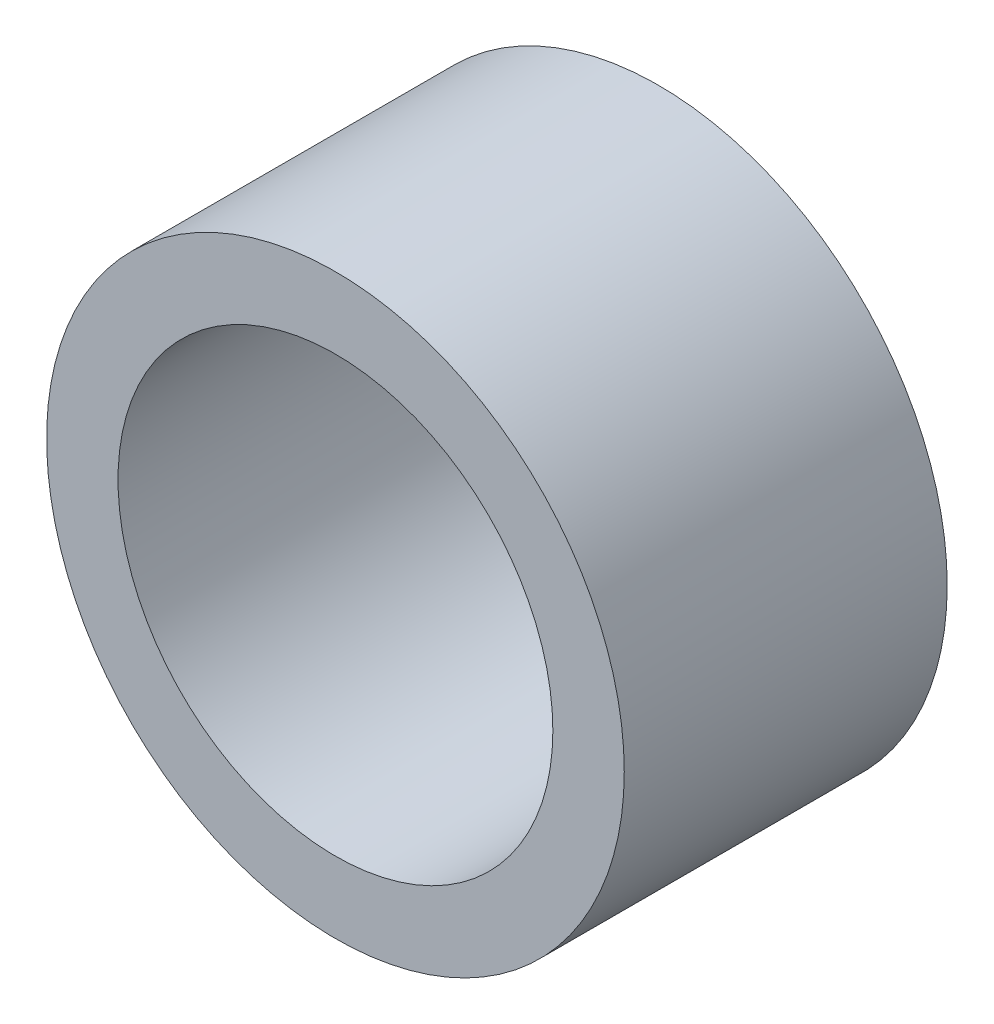
ISO-10303-21;
HEADER;
FILE_DESCRIPTION(('STEP AP214'),'2;1');
FILE_NAME('part.step','',(''),(''),'','','');
FILE_SCHEMA(('AUTOMOTIVE_DESIGN { 1 0 10303 214 1 1 1 1 }'));
ENDSEC;
DATA;
#1=APPLICATION_CONTEXT('core data for automotive mechanical design processes');
#2=APPLICATION_PROTOCOL_DEFINITION('international standard','automotive_design',2000,#1);
#3=PRODUCT_CONTEXT('',#1,'mechanical');
#4=PRODUCT('Part','Part','',(#3));
#5=PRODUCT_RELATED_PRODUCT_CATEGORY('part','',(#4));
#6=PRODUCT_DEFINITION_FORMATION('','',#4);
#7=PRODUCT_DEFINITION_CONTEXT('part definition',#1,'design');
#8=PRODUCT_DEFINITION('design','',#6,#7);
#9=PRODUCT_DEFINITION_SHAPE('','',#8);
#10=(LENGTH_UNIT() NAMED_UNIT(*) SI_UNIT(.MILLI.,.METRE.));
#11=(NAMED_UNIT(*) PLANE_ANGLE_UNIT() SI_UNIT($,.RADIAN.));
#12=(NAMED_UNIT(*) SI_UNIT($,.STERADIAN.) SOLID_ANGLE_UNIT());
#13=UNCERTAINTY_MEASURE_WITH_UNIT(LENGTH_MEASURE(1.E-05),#10,'distance_accuracy_value','');
#14=(GEOMETRIC_REPRESENTATION_CONTEXT(3) GLOBAL_UNCERTAINTY_ASSIGNED_CONTEXT((#13)) GLOBAL_UNIT_ASSIGNED_CONTEXT((#10,
#11,#12)) REPRESENTATION_CONTEXT('',''));
#15=CARTESIAN_POINT('',(0.,0.,0.));
#16=DIRECTION('',(0.,0.,1.));
#17=DIRECTION('',(1.,0.,0.));
#18=AXIS2_PLACEMENT_3D('',#15,#16,#17);
#19=CARTESIAN_POINT('',(0.,0.,14.2));
#20=DIRECTION('',(0.,0.,1.));
#21=DIRECTION('',(1.,0.,0.));
#22=AXIS2_PLACEMENT_3D('',#19,#20,#21);
#23=PLANE('',#22);
#24=CARTESIAN_POINT('',(0.,0.,14.2));
#25=DIRECTION('',(0.,0.,1.));
#26=DIRECTION('',(1.,0.,0.));
#27=AXIS2_PLACEMENT_3D('',#24,#25,#26);
#28=CIRCLE('',#27,12.7);
#29=CARTESIAN_POINT('',(12.7,0.,14.2));
#30=VERTEX_POINT('',#29);
#31=EDGE_CURVE('E10',#30,#30,#28,.T.);
#32=ORIENTED_EDGE('',*,*,#31,.T.);
#33=EDGE_LOOP('',(#32));
#34=FACE_BOUND('',#33,.T.);
#35=CARTESIAN_POINT('',(0.,0.,14.2));
#36=DIRECTION('',(0.,0.,1.));
#37=DIRECTION('',(1.,0.,0.));
#38=AXIS2_PLACEMENT_3D('',#35,#36,#37);
#39=CIRCLE('',#38,9.56);
#40=CARTESIAN_POINT('',(9.56,0.,14.2));
#41=VERTEX_POINT('',#40);
#42=EDGE_CURVE('E41',#41,#41,#39,.T.);
#43=ORIENTED_EDGE('',*,*,#42,.F.);
#44=EDGE_LOOP('',(#43));
#45=FACE_BOUND('',#44,.T.);
#46=ADVANCED_FACE('F30',(#34,#45),#23,.T.);
#47=CARTESIAN_POINT('',(0.,0.,0.));
#48=DIRECTION('',(0.,0.,1.));
#49=DIRECTION('',(1.,0.,0.));
#50=AXIS2_PLACEMENT_3D('',#47,#48,#49);
#51=PLANE('',#50);
#52=CARTESIAN_POINT('',(0.,0.,0.));
#53=DIRECTION('',(0.,0.,1.));
#54=DIRECTION('',(1.,0.,0.));
#55=AXIS2_PLACEMENT_3D('',#52,#53,#54);
#56=CIRCLE('',#55,12.7);
#57=CARTESIAN_POINT('',(12.7,0.,0.));
#58=VERTEX_POINT('',#57);
#59=EDGE_CURVE('E34',#58,#58,#56,.T.);
#60=ORIENTED_EDGE('',*,*,#59,.F.);
#61=EDGE_LOOP('',(#60));
#62=FACE_BOUND('',#61,.T.);
#63=CARTESIAN_POINT('',(0.,0.,0.));
#64=DIRECTION('',(0.,0.,1.));
#65=DIRECTION('',(1.,0.,0.));
#66=AXIS2_PLACEMENT_3D('',#63,#64,#65);
#67=CIRCLE('',#66,9.56);
#68=CARTESIAN_POINT('',(9.56,0.,0.));
#69=VERTEX_POINT('',#68);
#70=EDGE_CURVE('E43',#69,#69,#67,.T.);
#71=ORIENTED_EDGE('',*,*,#70,.T.);
#72=EDGE_LOOP('',(#71));
#73=FACE_BOUND('',#72,.T.);
#74=ADVANCED_FACE('F53',(#62,#73),#51,.F.);
#75=CARTESIAN_POINT('',(0.,0.,14.2));
#76=DIRECTION('',(0.,0.,-1.));
#77=DIRECTION('',(-1.,0.,0.));
#78=AXIS2_PLACEMENT_3D('',#75,#76,#77);
#79=CYLINDRICAL_SURFACE('',#78,12.7);
#80=ORIENTED_EDGE('',*,*,#31,.F.);
#81=EDGE_LOOP('',(#80));
#82=FACE_BOUND('',#81,.T.);
#83=ORIENTED_EDGE('',*,*,#59,.T.);
#84=EDGE_LOOP('',(#83));
#85=FACE_BOUND('',#84,.T.);
#86=ADVANCED_FACE('F32',(#82,#85),#79,.T.);
#87=CARTESIAN_POINT('',(0.,0.,14.2));
#88=DIRECTION('',(0.,0.,-1.));
#89=DIRECTION('',(-1.,0.,0.));
#90=AXIS2_PLACEMENT_3D('',#87,#88,#89);
#91=CYLINDRICAL_SURFACE('',#90,9.56);
#92=ORIENTED_EDGE('',*,*,#42,.T.);
#93=EDGE_LOOP('',(#92));
#94=FACE_BOUND('',#93,.T.);
#95=ORIENTED_EDGE('',*,*,#70,.F.);
#96=EDGE_LOOP('',(#95));
#97=FACE_BOUND('',#96,.T.);
#98=ADVANCED_FACE('F49',(#94,#97),#91,.F.);
#99=CLOSED_SHELL('',(#46,#74,#86,#98));
#100=MANIFOLD_SOLID_BREP('B2',#99);
#101=ADVANCED_BREP_SHAPE_REPRESENTATION('',(#18,#100),#14);
#102=SHAPE_DEFINITION_REPRESENTATION(#9,#101);
ENDSEC;
END-ISO-10303-21;
